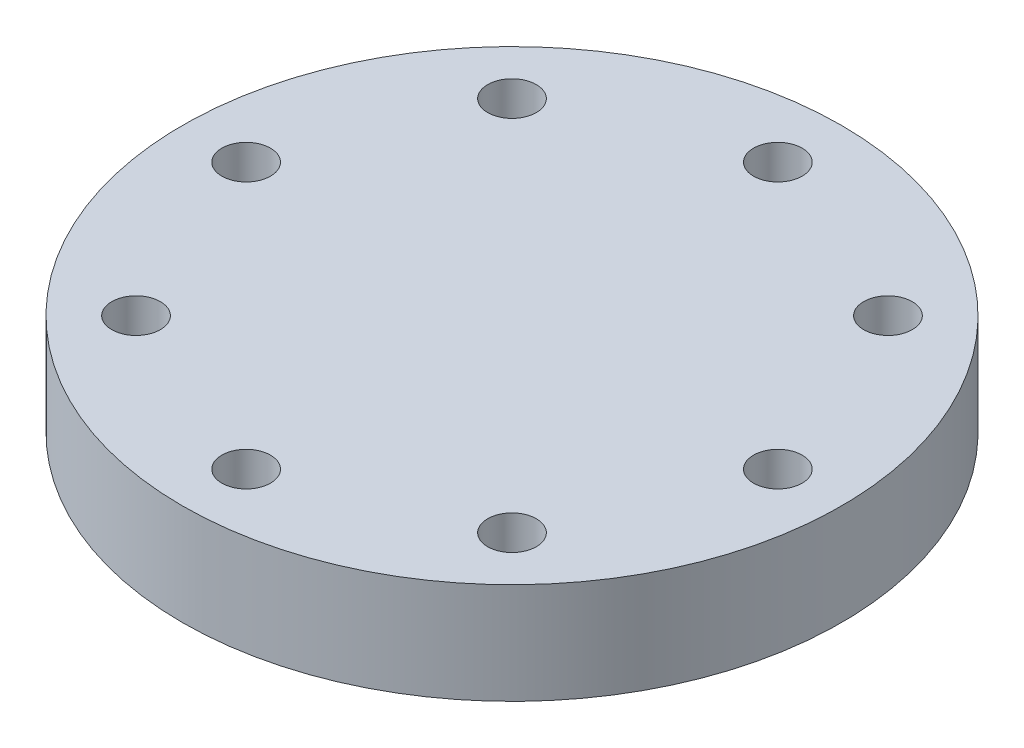
ISO-10303-21;
HEADER;
FILE_DESCRIPTION(('STEP AP214'),'2;1');
FILE_NAME('part.step','',(''),(''),'','','');
FILE_SCHEMA(('AUTOMOTIVE_DESIGN { 1 0 10303 214 1 1 1 1 }'));
ENDSEC;
DATA;
#1=APPLICATION_CONTEXT('core data for automotive mechanical design processes');
#2=APPLICATION_PROTOCOL_DEFINITION('international standard','automotive_design',2000,#1);
#3=PRODUCT_CONTEXT('',#1,'mechanical');
#4=PRODUCT('Part','Part','',(#3));
#5=PRODUCT_RELATED_PRODUCT_CATEGORY('part','',(#4));
#6=PRODUCT_DEFINITION_FORMATION('','',#4);
#7=PRODUCT_DEFINITION_CONTEXT('part definition',#1,'design');
#8=PRODUCT_DEFINITION('design','',#6,#7);
#9=PRODUCT_DEFINITION_SHAPE('','',#8);
#10=(LENGTH_UNIT() NAMED_UNIT(*) SI_UNIT(.MILLI.,.METRE.));
#11=(NAMED_UNIT(*) PLANE_ANGLE_UNIT() SI_UNIT($,.RADIAN.));
#12=(NAMED_UNIT(*) SI_UNIT($,.STERADIAN.) SOLID_ANGLE_UNIT());
#13=UNCERTAINTY_MEASURE_WITH_UNIT(LENGTH_MEASURE(1.E-05),#10,'distance_accuracy_value','');
#14=(GEOMETRIC_REPRESENTATION_CONTEXT(3) GLOBAL_UNCERTAINTY_ASSIGNED_CONTEXT((#13)) GLOBAL_UNIT_ASSIGNED_CONTEXT((#10,
#11,#12)) REPRESENTATION_CONTEXT('',''));
#15=CARTESIAN_POINT('',(0.,0.,0.));
#16=DIRECTION('',(0.,0.,1.));
#17=DIRECTION('',(1.,0.,0.));
#18=AXIS2_PLACEMENT_3D('',#15,#16,#17);
#19=CARTESIAN_POINT('',(0.,17.526,0.));
#20=DIRECTION('',(0.,1.,0.));
#21=DIRECTION('',(0.,0.,1.));
#22=AXIS2_PLACEMENT_3D('',#19,#20,#21);
#23=PLANE('',#22);
#24=CARTESIAN_POINT('',(46.101,17.526,-4.82882343606022E-13));
#25=DIRECTION('',(0.,1.,0.));
#26=DIRECTION('',(-1.,0.,0.));
#27=AXIS2_PLACEMENT_3D('',#24,#25,#26);
#28=CIRCLE('',#27,4.2164);
#29=CARTESIAN_POINT('',(41.8846,17.526,-4.38717897854727E-13));
#30=VERTEX_POINT('',#29);
#31=EDGE_CURVE('E74',#30,#30,#28,.T.);
#32=ORIENTED_EDGE('',*,*,#31,.F.);
#33=EDGE_LOOP('',(#32));
#34=FACE_BOUND('',#33,.T.);
#35=CARTESIAN_POINT('',(3.21921562404015E-13,17.526,46.101));
#36=DIRECTION('',(0.,1.,0.));
#37=DIRECTION('',(0.,0.,-1.));
#38=AXIS2_PLACEMENT_3D('',#35,#36,#37);
#39=CIRCLE('',#38,4.2164);
#40=CARTESIAN_POINT('',(2.92478598569818E-13,17.526,41.8846));
#41=VERTEX_POINT('',#40);
#42=EDGE_CURVE('E62',#41,#41,#39,.T.);
#43=ORIENTED_EDGE('',*,*,#42,.F.);
#44=EDGE_LOOP('',(#43));
#45=FACE_BOUND('',#44,.T.);
#46=CARTESIAN_POINT('',(-46.101,17.526,1.60960781202007E-13));
#47=DIRECTION('',(0.,1.,0.));
#48=DIRECTION('',(1.,0.,0.));
#49=AXIS2_PLACEMENT_3D('',#46,#47,#48);
#50=CIRCLE('',#49,4.2164);
#51=CARTESIAN_POINT('',(-41.8846,17.526,1.46239299284909E-13));
#52=VERTEX_POINT('',#51);
#53=EDGE_CURVE('E50',#52,#52,#50,.T.);
#54=ORIENTED_EDGE('',*,*,#53,.F.);
#55=EDGE_LOOP('',(#54));
#56=FACE_BOUND('',#55,.T.);
#57=CARTESIAN_POINT('',(0.,17.526,-46.101));
#58=DIRECTION('',(0.,1.,0.));
#59=DIRECTION('',(0.,0.,1.));
#60=AXIS2_PLACEMENT_3D('',#57,#58,#59);
#61=CIRCLE('',#60,4.2164);
#62=CARTESIAN_POINT('',(0.,17.526,-41.8846));
#63=VERTEX_POINT('',#62);
#64=EDGE_CURVE('E39',#63,#63,#61,.T.);
#65=ORIENTED_EDGE('',*,*,#64,.F.);
#66=EDGE_LOOP('',(#65));
#67=FACE_BOUND('',#66,.T.);
#68=CARTESIAN_POINT('',(0.,17.526,0.));
#69=DIRECTION('',(0.,1.,0.));
#70=DIRECTION('',(0.,0.,1.));
#71=AXIS2_PLACEMENT_3D('',#68,#69,#70);
#72=CIRCLE('',#71,57.15);
#73=CARTESIAN_POINT('',(0.,17.526,57.15));
#74=VERTEX_POINT('',#73);
#75=EDGE_CURVE('E10',#74,#74,#72,.T.);
#76=ORIENTED_EDGE('',*,*,#75,.T.);
#77=EDGE_LOOP('',(#76));
#78=FACE_BOUND('',#77,.T.);
#79=CARTESIAN_POINT('',(-32.5983297194811,17.526,-32.598329719481));
#80=DIRECTION('',(0.,1.,0.));
#81=DIRECTION('',(0.707106781186549,0.,0.707106781186546));
#82=AXIS2_PLACEMENT_3D('',#79,#80,#81);
#83=CIRCLE('',#82,4.2164);
#84=CARTESIAN_POINT('',(-29.6168846872861,17.526,-29.616884687286));
#85=VERTEX_POINT('',#84);
#86=EDGE_CURVE('E44',#85,#85,#83,.T.);
#87=ORIENTED_EDGE('',*,*,#86,.F.);
#88=EDGE_LOOP('',(#87));
#89=FACE_BOUND('',#88,.T.);
#90=CARTESIAN_POINT('',(-32.5983297194809,17.526,32.5983297194812));
#91=DIRECTION('',(0.,1.,0.));
#92=DIRECTION('',(0.707106781186544,0.,-0.707106781186551));
#93=AXIS2_PLACEMENT_3D('',#90,#91,#92);
#94=CIRCLE('',#93,4.2164);
#95=CARTESIAN_POINT('',(-29.6168846872859,17.526,29.6168846872862));
#96=VERTEX_POINT('',#95);
#97=EDGE_CURVE('E56',#96,#96,#94,.T.);
#98=ORIENTED_EDGE('',*,*,#97,.F.);
#99=EDGE_LOOP('',(#98));
#100=FACE_BOUND('',#99,.T.);
#101=CARTESIAN_POINT('',(32.5983297194813,17.526,32.5983297194807));
#102=DIRECTION('',(0.,1.,0.));
#103=DIRECTION('',(-0.707106781186554,0.,-0.707106781186541));
#104=AXIS2_PLACEMENT_3D('',#101,#102,#103);
#105=CIRCLE('',#104,4.2164);
#106=CARTESIAN_POINT('',(29.6168846872863,17.526,29.6168846872858));
#107=VERTEX_POINT('',#106);
#108=EDGE_CURVE('E68',#107,#107,#105,.T.);
#109=ORIENTED_EDGE('',*,*,#108,.F.);
#110=EDGE_LOOP('',(#109));
#111=FACE_BOUND('',#110,.T.);
#112=CARTESIAN_POINT('',(32.5983297194806,17.526,-32.5983297194814));
#113=DIRECTION('',(0.,1.,0.));
#114=DIRECTION('',(-0.707106781186539,0.,0.707106781186556));
#115=AXIS2_PLACEMENT_3D('',#112,#113,#114);
#116=CIRCLE('',#115,4.2164);
#117=CARTESIAN_POINT('',(29.6168846872857,17.526,-29.6168846872864));
#118=VERTEX_POINT('',#117);
#119=EDGE_CURVE('E80',#118,#118,#116,.T.);
#120=ORIENTED_EDGE('',*,*,#119,.F.);
#121=EDGE_LOOP('',(#120));
#122=FACE_BOUND('',#121,.T.);
#123=ADVANCED_FACE('F28',(#34,#45,#56,#67,#78,#89,#100,#111,#122),#23,.T.);
#124=CARTESIAN_POINT('',(0.,0.,0.));
#125=DIRECTION('',(0.,1.,0.));
#126=DIRECTION('',(0.,0.,1.));
#127=AXIS2_PLACEMENT_3D('',#124,#125,#126);
#128=PLANE('',#127);
#129=CARTESIAN_POINT('',(46.101,0.,-4.82882343606022E-13));
#130=DIRECTION('',(0.,1.,0.));
#131=DIRECTION('',(-1.,0.,0.));
#132=AXIS2_PLACEMENT_3D('',#129,#130,#131);
#133=CIRCLE('',#132,4.2164);
#134=CARTESIAN_POINT('',(41.8846,0.,-4.38717897854727E-13));
#135=VERTEX_POINT('',#134);
#136=EDGE_CURVE('E77',#135,#135,#133,.T.);
#137=ORIENTED_EDGE('',*,*,#136,.T.);
#138=EDGE_LOOP('',(#137));
#139=FACE_BOUND('',#138,.T.);
#140=CARTESIAN_POINT('',(3.21921562404015E-13,0.,46.101));
#141=DIRECTION('',(0.,1.,0.));
#142=DIRECTION('',(0.,0.,-1.));
#143=AXIS2_PLACEMENT_3D('',#140,#141,#142);
#144=CIRCLE('',#143,4.2164);
#145=CARTESIAN_POINT('',(2.92478598569818E-13,0.,41.8846));
#146=VERTEX_POINT('',#145);
#147=EDGE_CURVE('E65',#146,#146,#144,.T.);
#148=ORIENTED_EDGE('',*,*,#147,.T.);
#149=EDGE_LOOP('',(#148));
#150=FACE_BOUND('',#149,.T.);
#151=CARTESIAN_POINT('',(-46.101,0.,1.60960781202007E-13));
#152=DIRECTION('',(0.,1.,0.));
#153=DIRECTION('',(1.,0.,0.));
#154=AXIS2_PLACEMENT_3D('',#151,#152,#153);
#155=CIRCLE('',#154,4.2164);
#156=CARTESIAN_POINT('',(-41.8846,0.,1.46239299284909E-13));
#157=VERTEX_POINT('',#156);
#158=EDGE_CURVE('E53',#157,#157,#155,.T.);
#159=ORIENTED_EDGE('',*,*,#158,.T.);
#160=EDGE_LOOP('',(#159));
#161=FACE_BOUND('',#160,.T.);
#162=CARTESIAN_POINT('',(0.,0.,-46.101));
#163=DIRECTION('',(0.,1.,0.));
#164=DIRECTION('',(0.,0.,1.));
#165=AXIS2_PLACEMENT_3D('',#162,#163,#164);
#166=CIRCLE('',#165,4.2164);
#167=CARTESIAN_POINT('',(0.,0.,-41.8846));
#168=VERTEX_POINT('',#167);
#169=EDGE_CURVE('E41',#168,#168,#166,.T.);
#170=ORIENTED_EDGE('',*,*,#169,.T.);
#171=EDGE_LOOP('',(#170));
#172=FACE_BOUND('',#171,.T.);
#173=CARTESIAN_POINT('',(0.,0.,0.));
#174=DIRECTION('',(0.,1.,0.));
#175=DIRECTION('',(0.,0.,1.));
#176=AXIS2_PLACEMENT_3D('',#173,#174,#175);
#177=CIRCLE('',#176,57.15);
#178=CARTESIAN_POINT('',(0.,0.,57.15));
#179=VERTEX_POINT('',#178);
#180=EDGE_CURVE('E32',#179,#179,#177,.T.);
#181=ORIENTED_EDGE('',*,*,#180,.F.);
#182=EDGE_LOOP('',(#181));
#183=FACE_BOUND('',#182,.T.);
#184=CARTESIAN_POINT('',(-32.5983297194811,0.,-32.598329719481));
#185=DIRECTION('',(0.,1.,0.));
#186=DIRECTION('',(0.707106781186549,0.,0.707106781186546));
#187=AXIS2_PLACEMENT_3D('',#184,#185,#186);
#188=CIRCLE('',#187,4.2164);
#189=CARTESIAN_POINT('',(-29.6168846872861,0.,-29.616884687286));
#190=VERTEX_POINT('',#189);
#191=EDGE_CURVE('E47',#190,#190,#188,.T.);
#192=ORIENTED_EDGE('',*,*,#191,.T.);
#193=EDGE_LOOP('',(#192));
#194=FACE_BOUND('',#193,.T.);
#195=CARTESIAN_POINT('',(-32.5983297194809,0.,32.5983297194812));
#196=DIRECTION('',(0.,1.,0.));
#197=DIRECTION('',(0.707106781186544,0.,-0.707106781186551));
#198=AXIS2_PLACEMENT_3D('',#195,#196,#197);
#199=CIRCLE('',#198,4.2164);
#200=CARTESIAN_POINT('',(-29.6168846872859,0.,29.6168846872862));
#201=VERTEX_POINT('',#200);
#202=EDGE_CURVE('E59',#201,#201,#199,.T.);
#203=ORIENTED_EDGE('',*,*,#202,.T.);
#204=EDGE_LOOP('',(#203));
#205=FACE_BOUND('',#204,.T.);
#206=CARTESIAN_POINT('',(32.5983297194813,0.,32.5983297194807));
#207=DIRECTION('',(0.,1.,0.));
#208=DIRECTION('',(-0.707106781186554,0.,-0.707106781186541));
#209=AXIS2_PLACEMENT_3D('',#206,#207,#208);
#210=CIRCLE('',#209,4.2164);
#211=CARTESIAN_POINT('',(29.6168846872863,0.,29.6168846872858));
#212=VERTEX_POINT('',#211);
#213=EDGE_CURVE('E71',#212,#212,#210,.T.);
#214=ORIENTED_EDGE('',*,*,#213,.T.);
#215=EDGE_LOOP('',(#214));
#216=FACE_BOUND('',#215,.T.);
#217=CARTESIAN_POINT('',(32.5983297194806,0.,-32.5983297194814));
#218=DIRECTION('',(0.,1.,0.));
#219=DIRECTION('',(-0.707106781186539,0.,0.707106781186556));
#220=AXIS2_PLACEMENT_3D('',#217,#218,#219);
#221=CIRCLE('',#220,4.2164);
#222=CARTESIAN_POINT('',(29.6168846872857,0.,-29.6168846872864));
#223=VERTEX_POINT('',#222);
#224=EDGE_CURVE('E83',#223,#223,#221,.T.);
#225=ORIENTED_EDGE('',*,*,#224,.T.);
#226=EDGE_LOOP('',(#225));
#227=FACE_BOUND('',#226,.T.);
#228=ADVANCED_FACE('F93',(#139,#150,#161,#172,#183,#194,#205,#216,#227),#128,.F.);
#229=CARTESIAN_POINT('',(0.,17.526,0.));
#230=DIRECTION('',(0.,-1.,0.));
#231=DIRECTION('',(0.,0.,-1.));
#232=AXIS2_PLACEMENT_3D('',#229,#230,#231);
#233=CYLINDRICAL_SURFACE('',#232,57.15);
#234=ORIENTED_EDGE('',*,*,#75,.F.);
#235=EDGE_LOOP('',(#234));
#236=FACE_BOUND('',#235,.T.);
#237=ORIENTED_EDGE('',*,*,#180,.T.);
#238=EDGE_LOOP('',(#237));
#239=FACE_BOUND('',#238,.T.);
#240=ADVANCED_FACE('F30',(#236,#239),#233,.T.);
#241=CARTESIAN_POINT('',(0.,17.526,-46.101));
#242=DIRECTION('',(0.,-1.,0.));
#243=DIRECTION('',(0.,0.,-1.));
#244=AXIS2_PLACEMENT_3D('',#241,#242,#243);
#245=CYLINDRICAL_SURFACE('',#244,4.2164);
#246=ORIENTED_EDGE('',*,*,#64,.T.);
#247=EDGE_LOOP('',(#246));
#248=FACE_BOUND('',#247,.T.);
#249=ORIENTED_EDGE('',*,*,#169,.F.);
#250=EDGE_LOOP('',(#249));
#251=FACE_BOUND('',#250,.T.);
#252=ADVANCED_FACE('F103',(#248,#251),#245,.F.);
#253=CARTESIAN_POINT('',(-32.5983297194811,17.526,-32.598329719481));
#254=DIRECTION('',(0.,-1.,0.));
#255=DIRECTION('',(0.,0.,-1.));
#256=AXIS2_PLACEMENT_3D('',#253,#254,#255);
#257=CYLINDRICAL_SURFACE('',#256,4.2164);
#258=ORIENTED_EDGE('',*,*,#86,.T.);
#259=EDGE_LOOP('',(#258));
#260=FACE_BOUND('',#259,.T.);
#261=ORIENTED_EDGE('',*,*,#191,.F.);
#262=EDGE_LOOP('',(#261));
#263=FACE_BOUND('',#262,.T.);
#264=ADVANCED_FACE('F106',(#260,#263),#257,.F.);
#265=CARTESIAN_POINT('',(-46.101,17.526,1.60960781202007E-13));
#266=DIRECTION('',(0.,-1.,0.));
#267=DIRECTION('',(0.,0.,-1.));
#268=AXIS2_PLACEMENT_3D('',#265,#266,#267);
#269=CYLINDRICAL_SURFACE('',#268,4.2164);
#270=ORIENTED_EDGE('',*,*,#53,.T.);
#271=EDGE_LOOP('',(#270));
#272=FACE_BOUND('',#271,.T.);
#273=ORIENTED_EDGE('',*,*,#158,.F.);
#274=EDGE_LOOP('',(#273));
#275=FACE_BOUND('',#274,.T.);
#276=ADVANCED_FACE('F110',(#272,#275),#269,.F.);
#277=CARTESIAN_POINT('',(-32.5983297194809,17.526,32.5983297194812));
#278=DIRECTION('',(0.,-1.,0.));
#279=DIRECTION('',(0.,0.,-1.));
#280=AXIS2_PLACEMENT_3D('',#277,#278,#279);
#281=CYLINDRICAL_SURFACE('',#280,4.2164);
#282=ORIENTED_EDGE('',*,*,#97,.T.);
#283=EDGE_LOOP('',(#282));
#284=FACE_BOUND('',#283,.T.);
#285=ORIENTED_EDGE('',*,*,#202,.F.);
#286=EDGE_LOOP('',(#285));
#287=FACE_BOUND('',#286,.T.);
#288=ADVANCED_FACE('F114',(#284,#287),#281,.F.);
#289=CARTESIAN_POINT('',(3.21921562404015E-13,17.526,46.101));
#290=DIRECTION('',(0.,-1.,0.));
#291=DIRECTION('',(0.,0.,-1.));
#292=AXIS2_PLACEMENT_3D('',#289,#290,#291);
#293=CYLINDRICAL_SURFACE('',#292,4.2164);
#294=ORIENTED_EDGE('',*,*,#42,.T.);
#295=EDGE_LOOP('',(#294));
#296=FACE_BOUND('',#295,.T.);
#297=ORIENTED_EDGE('',*,*,#147,.F.);
#298=EDGE_LOOP('',(#297));
#299=FACE_BOUND('',#298,.T.);
#300=ADVANCED_FACE('F118',(#296,#299),#293,.F.);
#301=CARTESIAN_POINT('',(32.5983297194813,17.526,32.5983297194807));
#302=DIRECTION('',(0.,-1.,0.));
#303=DIRECTION('',(0.,0.,-1.));
#304=AXIS2_PLACEMENT_3D('',#301,#302,#303);
#305=CYLINDRICAL_SURFACE('',#304,4.2164);
#306=ORIENTED_EDGE('',*,*,#108,.T.);
#307=EDGE_LOOP('',(#306));
#308=FACE_BOUND('',#307,.T.);
#309=ORIENTED_EDGE('',*,*,#213,.F.);
#310=EDGE_LOOP('',(#309));
#311=FACE_BOUND('',#310,.T.);
#312=ADVANCED_FACE('F122',(#308,#311),#305,.F.);
#313=CARTESIAN_POINT('',(46.101,17.526,-4.82882343606022E-13));
#314=DIRECTION('',(0.,-1.,0.));
#315=DIRECTION('',(0.,0.,-1.));
#316=AXIS2_PLACEMENT_3D('',#313,#314,#315);
#317=CYLINDRICAL_SURFACE('',#316,4.2164);
#318=ORIENTED_EDGE('',*,*,#31,.T.);
#319=EDGE_LOOP('',(#318));
#320=FACE_BOUND('',#319,.T.);
#321=ORIENTED_EDGE('',*,*,#136,.F.);
#322=EDGE_LOOP('',(#321));
#323=FACE_BOUND('',#322,.T.);
#324=ADVANCED_FACE('F126',(#320,#323),#317,.F.);
#325=CARTESIAN_POINT('',(32.5983297194806,17.526,-32.5983297194814));
#326=DIRECTION('',(0.,-1.,0.));
#327=DIRECTION('',(0.,0.,-1.));
#328=AXIS2_PLACEMENT_3D('',#325,#326,#327);
#329=CYLINDRICAL_SURFACE('',#328,4.2164);
#330=ORIENTED_EDGE('',*,*,#119,.T.);
#331=EDGE_LOOP('',(#330));
#332=FACE_BOUND('',#331,.T.);
#333=ORIENTED_EDGE('',*,*,#224,.F.);
#334=EDGE_LOOP('',(#333));
#335=FACE_BOUND('',#334,.T.);
#336=ADVANCED_FACE('F89',(#332,#335),#329,.F.);
#337=CLOSED_SHELL('',(#123,#228,#240,#252,#264,#276,#288,#300,#312,#324,#336));
#338=MANIFOLD_SOLID_BREP('B2',#337);
#339=ADVANCED_BREP_SHAPE_REPRESENTATION('',(#18,#338),#14);
#340=SHAPE_DEFINITION_REPRESENTATION(#9,#339);
ENDSEC;
END-ISO-10303-21;
